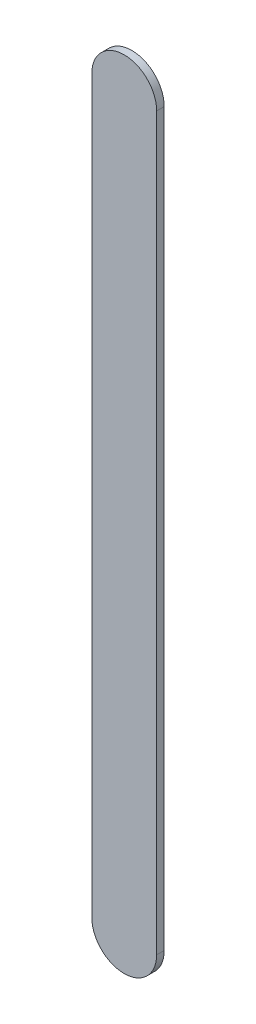
ISO-10303-21;
HEADER;
FILE_DESCRIPTION(('STEP AP214'),'2;1');
FILE_NAME('part.step','',(''),(''),'','','');
FILE_SCHEMA(('AUTOMOTIVE_DESIGN { 1 0 10303 214 1 1 1 1 }'));
ENDSEC;
DATA;
#1=APPLICATION_CONTEXT('core data for automotive mechanical design processes');
#2=APPLICATION_PROTOCOL_DEFINITION('international standard','automotive_design',2000,#1);
#3=PRODUCT_CONTEXT('',#1,'mechanical');
#4=PRODUCT('Part','Part','',(#3));
#5=PRODUCT_RELATED_PRODUCT_CATEGORY('part','',(#4));
#6=PRODUCT_DEFINITION_FORMATION('','',#4);
#7=PRODUCT_DEFINITION_CONTEXT('part definition',#1,'design');
#8=PRODUCT_DEFINITION('design','',#6,#7);
#9=PRODUCT_DEFINITION_SHAPE('','',#8);
#10=(LENGTH_UNIT() NAMED_UNIT(*) SI_UNIT(.MILLI.,.METRE.));
#11=(NAMED_UNIT(*) PLANE_ANGLE_UNIT() SI_UNIT($,.RADIAN.));
#12=(NAMED_UNIT(*) SI_UNIT($,.STERADIAN.) SOLID_ANGLE_UNIT());
#13=UNCERTAINTY_MEASURE_WITH_UNIT(LENGTH_MEASURE(1.E-05),#10,'distance_accuracy_value','');
#14=(GEOMETRIC_REPRESENTATION_CONTEXT(3) GLOBAL_UNCERTAINTY_ASSIGNED_CONTEXT((#13)) GLOBAL_UNIT_ASSIGNED_CONTEXT((#10,
#11,#12)) REPRESENTATION_CONTEXT('',''));
#15=CARTESIAN_POINT('',(0.,0.,0.));
#16=DIRECTION('',(0.,0.,1.));
#17=DIRECTION('',(1.,0.,0.));
#18=AXIS2_PLACEMENT_3D('',#15,#16,#17);
#19=CARTESIAN_POINT('',(126.89,-72.45,1.635));
#20=DIRECTION('',(0.,0.,1.));
#21=DIRECTION('',(1.,0.,0.));
#22=AXIS2_PLACEMENT_3D('',#19,#20,#21);
#23=PLANE('',#22);
#24=DIRECTION('',(0.,-1.,0.));
#25=VECTOR('',#24,1.);
#26=CARTESIAN_POINT('',(126.89,-72.45,1.635));
#27=LINE('',#26,#25);
#28=CARTESIAN_POINT('',(126.89,-72.45,1.635));
#29=VERTEX_POINT('',#28);
#30=CARTESIAN_POINT('',(126.89,-75.83,1.635));
#31=VERTEX_POINT('',#30);
#32=EDGE_CURVE('E83',#29,#31,#27,.T.);
#33=ORIENTED_EDGE('',*,*,#32,.T.);
#34=CARTESIAN_POINT('',(127.04,-75.83,1.635));
#35=DIRECTION('',(0.,0.,1.));
#36=DIRECTION('',(-1.,0.,0.));
#37=AXIS2_PLACEMENT_3D('',#34,#35,#36);
#38=CIRCLE('',#37,0.15);
#39=CARTESIAN_POINT('',(127.19,-75.83,1.635));
#40=VERTEX_POINT('',#39);
#41=EDGE_CURVE('E81',#31,#40,#38,.T.);
#42=ORIENTED_EDGE('',*,*,#41,.T.);
#43=DIRECTION('',(0.,1.,0.));
#44=VECTOR('',#43,1.);
#45=CARTESIAN_POINT('',(127.19,-75.83,1.635));
#46=LINE('',#45,#44);
#47=CARTESIAN_POINT('',(127.19,-72.45,1.635));
#48=VERTEX_POINT('',#47);
#49=EDGE_CURVE('E71',#40,#48,#46,.T.);
#50=ORIENTED_EDGE('',*,*,#49,.T.);
#51=CARTESIAN_POINT('',(127.04,-72.45,1.635));
#52=DIRECTION('',(0.,0.,1.));
#53=DIRECTION('',(1.,0.,0.));
#54=AXIS2_PLACEMENT_3D('',#51,#52,#53);
#55=CIRCLE('',#54,0.15);
#56=EDGE_CURVE('E11',#48,#29,#55,.T.);
#57=ORIENTED_EDGE('',*,*,#56,.T.);
#58=EDGE_LOOP('',(#33,#42,#50,#57));
#59=FACE_BOUND('',#58,.T.);
#60=ADVANCED_FACE('F17',(#59),#23,.T.);
#61=CARTESIAN_POINT('',(126.89,-72.45,1.6));
#62=DIRECTION('',(0.,0.,1.));
#63=DIRECTION('',(1.,0.,0.));
#64=AXIS2_PLACEMENT_3D('',#61,#62,#63);
#65=PLANE('',#64);
#66=CARTESIAN_POINT('',(127.04,-72.45,1.6));
#67=DIRECTION('',(0.,0.,1.));
#68=DIRECTION('',(1.,0.,0.));
#69=AXIS2_PLACEMENT_3D('',#66,#67,#68);
#70=CIRCLE('',#69,0.15);
#71=CARTESIAN_POINT('',(127.19,-72.45,1.6));
#72=VERTEX_POINT('',#71);
#73=CARTESIAN_POINT('',(126.89,-72.45,1.6));
#74=VERTEX_POINT('',#73);
#75=EDGE_CURVE('E27',#72,#74,#70,.T.);
#76=ORIENTED_EDGE('',*,*,#75,.F.);
#77=DIRECTION('',(0.,1.,0.));
#78=VECTOR('',#77,1.);
#79=CARTESIAN_POINT('',(127.19,-75.83,1.6));
#80=LINE('',#79,#78);
#81=CARTESIAN_POINT('',(127.19,-75.83,1.6));
#82=VERTEX_POINT('',#81);
#83=EDGE_CURVE('E64',#82,#72,#80,.T.);
#84=ORIENTED_EDGE('',*,*,#83,.F.);
#85=CARTESIAN_POINT('',(127.04,-75.83,1.6));
#86=DIRECTION('',(0.,0.,1.));
#87=DIRECTION('',(-1.,0.,0.));
#88=AXIS2_PLACEMENT_3D('',#85,#86,#87);
#89=CIRCLE('',#88,0.15);
#90=CARTESIAN_POINT('',(126.89,-75.83,1.6));
#91=VERTEX_POINT('',#90);
#92=EDGE_CURVE('E90',#91,#82,#89,.T.);
#93=ORIENTED_EDGE('',*,*,#92,.F.);
#94=DIRECTION('',(0.,-1.,0.));
#95=VECTOR('',#94,1.);
#96=CARTESIAN_POINT('',(126.89,-72.45,1.6));
#97=LINE('',#96,#95);
#98=EDGE_CURVE('E133',#74,#91,#97,.T.);
#99=ORIENTED_EDGE('',*,*,#98,.F.);
#100=EDGE_LOOP('',(#76,#84,#93,#99));
#101=FACE_BOUND('',#100,.T.);
#102=ADVANCED_FACE('F19',(#101),#65,.F.);
#103=CARTESIAN_POINT('',(127.04,-72.45,1.6));
#104=DIRECTION('',(0.,0.,-1.));
#105=DIRECTION('',(1.,0.,0.));
#106=AXIS2_PLACEMENT_3D('',#103,#104,#105);
#107=CYLINDRICAL_SURFACE('',#106,0.15);
#108=ORIENTED_EDGE('',*,*,#75,.T.);
#109=DIRECTION('',(0.,0.,1.));
#110=VECTOR('',#109,1.);
#111=CARTESIAN_POINT('',(126.89,-72.45,1.6));
#112=LINE('',#111,#110);
#113=EDGE_CURVE('E97',#74,#29,#112,.T.);
#114=ORIENTED_EDGE('',*,*,#113,.T.);
#115=ORIENTED_EDGE('',*,*,#56,.F.);
#116=DIRECTION('',(0.,0.,1.));
#117=VECTOR('',#116,1.);
#118=CARTESIAN_POINT('',(127.19,-72.45,1.6));
#119=LINE('',#118,#117);
#120=EDGE_CURVE('E77',#72,#48,#119,.T.);
#121=ORIENTED_EDGE('',*,*,#120,.F.);
#122=EDGE_LOOP('',(#108,#114,#115,#121));
#123=FACE_BOUND('',#122,.T.);
#124=ADVANCED_FACE('F178',(#123),#107,.T.);
#125=CARTESIAN_POINT('',(127.19,-75.83,1.6));
#126=DIRECTION('',(-1.,0.,0.));
#127=DIRECTION('',(0.,0.,1.));
#128=AXIS2_PLACEMENT_3D('',#125,#126,#127);
#129=PLANE('',#128);
#130=ORIENTED_EDGE('',*,*,#83,.T.);
#131=ORIENTED_EDGE('',*,*,#120,.T.);
#132=ORIENTED_EDGE('',*,*,#49,.F.);
#133=DIRECTION('',(0.,0.,1.));
#134=VECTOR('',#133,1.);
#135=CARTESIAN_POINT('',(127.19,-75.83,1.6));
#136=LINE('',#135,#134);
#137=EDGE_CURVE('E75',#82,#40,#136,.T.);
#138=ORIENTED_EDGE('',*,*,#137,.F.);
#139=EDGE_LOOP('',(#130,#131,#132,#138));
#140=FACE_BOUND('',#139,.T.);
#141=ADVANCED_FACE('F73',(#140),#129,.F.);
#142=CARTESIAN_POINT('',(127.04,-75.83,1.6));
#143=DIRECTION('',(0.,0.,-1.));
#144=DIRECTION('',(-1.,0.,0.));
#145=AXIS2_PLACEMENT_3D('',#142,#143,#144);
#146=CYLINDRICAL_SURFACE('',#145,0.15);
#147=ORIENTED_EDGE('',*,*,#92,.T.);
#148=ORIENTED_EDGE('',*,*,#137,.T.);
#149=ORIENTED_EDGE('',*,*,#41,.F.);
#150=DIRECTION('',(0.,0.,1.));
#151=VECTOR('',#150,1.);
#152=CARTESIAN_POINT('',(126.89,-75.83,1.6));
#153=LINE('',#152,#151);
#154=EDGE_CURVE('E129',#91,#31,#153,.T.);
#155=ORIENTED_EDGE('',*,*,#154,.F.);
#156=EDGE_LOOP('',(#147,#148,#149,#155));
#157=FACE_BOUND('',#156,.T.);
#158=ADVANCED_FACE('F89',(#157),#146,.T.);
#159=CARTESIAN_POINT('',(126.89,-72.45,1.6));
#160=DIRECTION('',(1.,0.,0.));
#161=DIRECTION('',(0.,1.,0.));
#162=AXIS2_PLACEMENT_3D('',#159,#160,#161);
#163=PLANE('',#162);
#164=ORIENTED_EDGE('',*,*,#98,.T.);
#165=ORIENTED_EDGE('',*,*,#154,.T.);
#166=ORIENTED_EDGE('',*,*,#32,.F.);
#167=ORIENTED_EDGE('',*,*,#113,.F.);
#168=EDGE_LOOP('',(#164,#165,#166,#167));
#169=FACE_BOUND('',#168,.T.);
#170=ADVANCED_FACE('F154',(#169),#163,.F.);
#171=CLOSED_SHELL('',(#60,#102,#124,#141,#158,#170));
#172=MANIFOLD_SOLID_BREP('B1',#171);
#173=ADVANCED_BREP_SHAPE_REPRESENTATION('',(#18,#172),#14);
#174=SHAPE_DEFINITION_REPRESENTATION(#9,#173);
ENDSEC;
END-ISO-10303-21;
